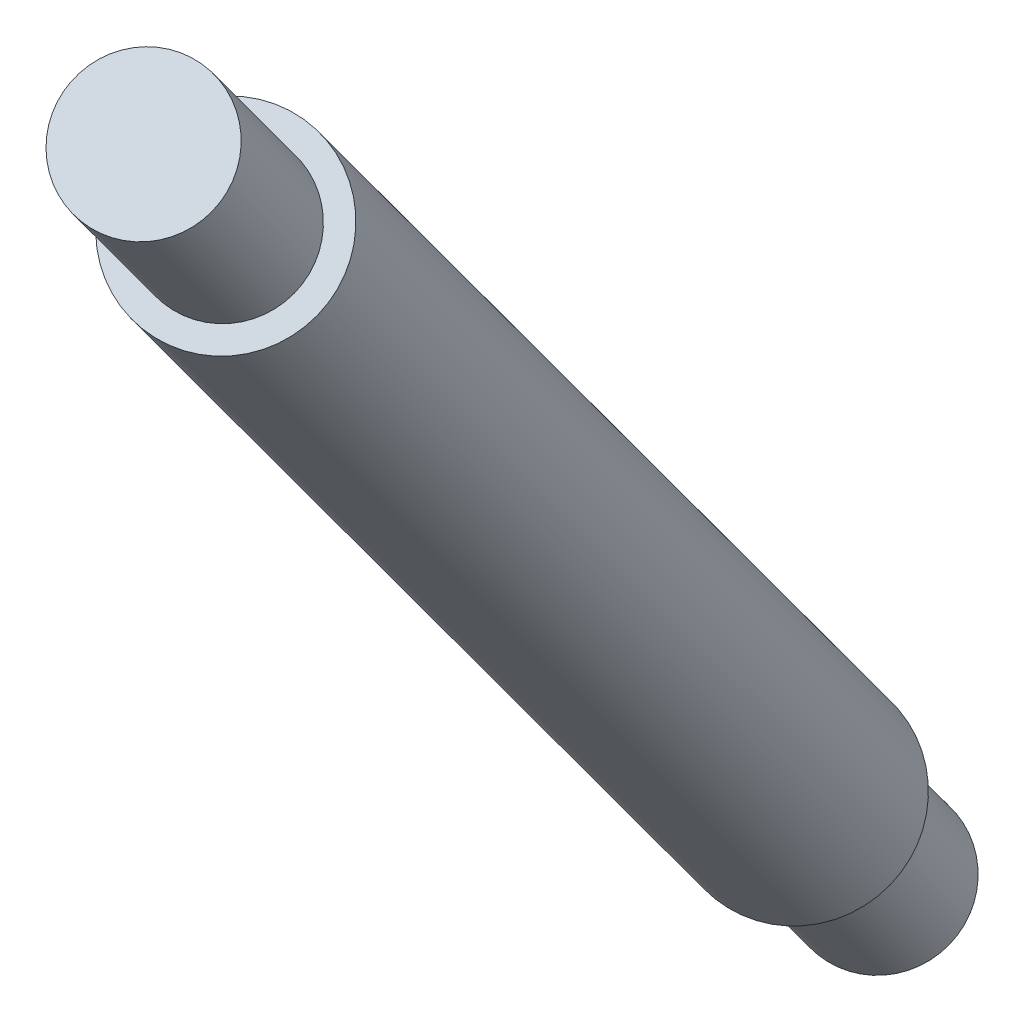
ISO-10303-21;
HEADER;
FILE_DESCRIPTION(('STEP AP214'),'2;1');
FILE_NAME('part.step','',(''),(''),'','','');
FILE_SCHEMA(('AUTOMOTIVE_DESIGN { 1 0 10303 214 1 1 1 1 }'));
ENDSEC;
DATA;
#1=APPLICATION_CONTEXT('core data for automotive mechanical design processes');
#2=APPLICATION_PROTOCOL_DEFINITION('international standard','automotive_design',2000,#1);
#3=PRODUCT_CONTEXT('',#1,'mechanical');
#4=PRODUCT('Part','Part','',(#3));
#5=PRODUCT_RELATED_PRODUCT_CATEGORY('part','',(#4));
#6=PRODUCT_DEFINITION_FORMATION('','',#4);
#7=PRODUCT_DEFINITION_CONTEXT('part definition',#1,'design');
#8=PRODUCT_DEFINITION('design','',#6,#7);
#9=PRODUCT_DEFINITION_SHAPE('','',#8);
#10=(LENGTH_UNIT() NAMED_UNIT(*) SI_UNIT(.MILLI.,.METRE.));
#11=(NAMED_UNIT(*) PLANE_ANGLE_UNIT() SI_UNIT($,.RADIAN.));
#12=(NAMED_UNIT(*) SI_UNIT($,.STERADIAN.) SOLID_ANGLE_UNIT());
#13=UNCERTAINTY_MEASURE_WITH_UNIT(LENGTH_MEASURE(1.E-05),#10,'distance_accuracy_value','');
#14=(GEOMETRIC_REPRESENTATION_CONTEXT(3) GLOBAL_UNCERTAINTY_ASSIGNED_CONTEXT((#13)) GLOBAL_UNIT_ASSIGNED_CONTEXT((#10,
#11,#12)) REPRESENTATION_CONTEXT('',''));
#15=CARTESIAN_POINT('',(0.,0.,0.));
#16=DIRECTION('',(0.,0.,1.));
#17=DIRECTION('',(1.,0.,0.));
#18=AXIS2_PLACEMENT_3D('',#15,#16,#17);
#19=CARTESIAN_POINT('',(-59.13249469121,-43.79049818765,8.643157456064));
#20=DIRECTION('',(0.352637034898918,0.707106781186952,0.612900580532543));
#21=DIRECTION('',(0.65489630431383,-0.654330019278361,0.378104557585951));
#22=AXIS2_PLACEMENT_3D('',#19,#20,#21);
#23=PLANE('',#22);
#24=CARTESIAN_POINT('',(-57.0389551413315,-44.3996323749582,8.14138494256849));
#25=DIRECTION('',(0.352637034898777,0.707106781187579,0.6129005805319));
#26=DIRECTION('',(0.,-0.654976126502471,0.75564957070842));
#27=AXIS2_PLACEMENT_3D('',#24,#25,#26);
#28=CIRCLE('',#27,1.50000000000611);
#29=CARTESIAN_POINT('',(-57.0389551413315,-45.3820965647159,9.27485929863574));
#30=VERTEX_POINT('',#29);
#31=EDGE_CURVE('E19',#30,#30,#28,.F.);
#32=ORIENTED_EDGE('',*,*,#31,.T.);
#33=EDGE_LOOP('',(#32));
#34=FACE_BOUND('',#33,.T.);
#35=ADVANCED_FACE('F15',(#34),#23,.F.);
#36=CARTESIAN_POINT('',(-57.0389551413315,-44.3996323749582,8.14138494256849));
#37=DIRECTION('',(0.352637034898777,0.707106781187579,0.6129005805319));
#38=DIRECTION('',(0.,-0.654976126502471,0.75564957070842));
#39=AXIS2_PLACEMENT_3D('',#36,#37,#38);
#40=CYLINDRICAL_SURFACE('',#39,1.50000000000611);
#41=CARTESIAN_POINT('',(-54.6586551557665,-39.6266616019456,12.2784638611557));
#42=DIRECTION('',(0.352637034898777,0.707106781187579,0.6129005805319));
#43=DIRECTION('',(0.,-0.654976126502471,0.75564957070842));
#44=AXIS2_PLACEMENT_3D('',#41,#42,#43);
#45=CIRCLE('',#44,1.50000000000611);
#46=CARTESIAN_POINT('',(-54.6586551557665,-40.6091257917033,13.411938217223));
#47=VERTEX_POINT('',#46);
#48=EDGE_CURVE('E35',#47,#47,#45,.F.);
#49=ORIENTED_EDGE('',*,*,#48,.T.);
#50=EDGE_LOOP('',(#49));
#51=FACE_BOUND('',#50,.T.);
#52=ORIENTED_EDGE('',*,*,#31,.F.);
#53=EDGE_LOOP('',(#52));
#54=FACE_BOUND('',#53,.T.);
#55=ADVANCED_FACE('F43',(#51,#54),#40,.T.);
#56=CARTESIAN_POINT('',(-57.41111052306,-38.82320468432,12.93515742184));
#57=DIRECTION('',(0.352637034898453,0.707106781187129,0.612900580532605));
#58=DIRECTION('',(0.654896304314089,-0.654330019278032,0.37810455758607));
#59=AXIS2_PLACEMENT_3D('',#56,#57,#58);
#60=PLANE('',#59);
#61=ORIENTED_EDGE('',*,*,#48,.F.);
#62=EDGE_LOOP('',(#61));
#63=FACE_BOUND('',#62,.T.);
#64=CARTESIAN_POINT('',(-54.6586551557654,-39.6266616019435,12.2784638611576));
#65=DIRECTION('',(0.352637034898778,0.70710678118758,0.612900580531898));
#66=DIRECTION('',(0.,-0.65497612650247,0.755649570708421));
#67=AXIS2_PLACEMENT_3D('',#64,#65,#66);
#68=CIRCLE('',#67,2.00000000002221);
#69=CARTESIAN_POINT('',(-54.6586551557654,-40.9366138549629,13.7897630025912));
#70=VERTEX_POINT('',#69);
#71=EDGE_CURVE('E33',#70,#70,#68,.F.);
#72=ORIENTED_EDGE('',*,*,#71,.T.);
#73=EDGE_LOOP('',(#72));
#74=FACE_BOUND('',#73,.T.);
#75=ADVANCED_FACE('F45',(#63,#74),#60,.F.);
#76=CARTESIAN_POINT('',(-54.6586551557654,-39.6266616019435,12.2784638611576));
#77=DIRECTION('',(0.352637034898778,0.70710678118758,0.612900580531898));
#78=DIRECTION('',(0.,-0.65497612650247,0.755649570708421));
#79=AXIS2_PLACEMENT_3D('',#76,#77,#78);
#80=CYLINDRICAL_SURFACE('',#79,2.00000000002221);
#81=CARTESIAN_POINT('',(-38.0847145155221,-6.3926428861257,41.0847911461581));
#82=DIRECTION('',(0.352637034898778,0.70710678118758,0.612900580531898));
#83=DIRECTION('',(0.,-0.65497612650247,0.755649570708421));
#84=AXIS2_PLACEMENT_3D('',#81,#82,#83);
#85=CIRCLE('',#84,2.00000000002221);
#86=CARTESIAN_POINT('',(-38.0847145155221,-7.70259513914519,42.5960902875917));
#87=VERTEX_POINT('',#86);
#88=EDGE_CURVE('E28',#87,#87,#85,.T.);
#89=ORIENTED_EDGE('',*,*,#88,.F.);
#90=EDGE_LOOP('',(#89));
#91=FACE_BOUND('',#90,.T.);
#92=ORIENTED_EDGE('',*,*,#71,.F.);
#93=EDGE_LOOP('',(#92));
#94=FACE_BOUND('',#93,.T.);
#95=ADVANCED_FACE('F52',(#91,#94),#80,.T.);
#96=CARTESIAN_POINT('',(-40.83716988284,-5.589185968545,41.7414847069));
#97=DIRECTION('',(0.352637034897914,0.70710678118629,0.612900580533884));
#98=DIRECTION('',(0.654896304312821,-0.654330019278925,0.378104557586722));
#99=AXIS2_PLACEMENT_3D('',#96,#97,#98);
#100=PLANE('',#99);
#101=CARTESIAN_POINT('',(-38.084714515521,-6.39264288612389,41.0847911461599));
#102=DIRECTION('',(0.352637034898776,0.707106781187582,0.612900580531898));
#103=DIRECTION('',(0.,-0.654976126502469,0.755649570708422));
#104=AXIS2_PLACEMENT_3D('',#101,#102,#103);
#105=CIRCLE('',#104,1.50000000004304);
#106=CARTESIAN_POINT('',(-38.084714515521,-7.37510707590578,42.218265502255));
#107=VERTEX_POINT('',#106);
#108=EDGE_CURVE('E23',#107,#107,#105,.F.);
#109=ORIENTED_EDGE('',*,*,#108,.T.);
#110=EDGE_LOOP('',(#109));
#111=FACE_BOUND('',#110,.T.);
#112=ORIENTED_EDGE('',*,*,#88,.T.);
#113=EDGE_LOOP('',(#112));
#114=FACE_BOUND('',#113,.T.);
#115=ADVANCED_FACE('F62',(#111,#114),#100,.T.);
#116=CARTESIAN_POINT('',(-38.084714515521,-6.39264288612389,41.0847911461599));
#117=DIRECTION('',(0.352637034898776,0.707106781187582,0.612900580531898));
#118=DIRECTION('',(0.,-0.654976126502469,0.755649570708422));
#119=AXIS2_PLACEMENT_3D('',#116,#117,#118);
#120=CYLINDRICAL_SURFACE('',#119,1.50000000004304);
#121=CARTESIAN_POINT('',(-35.7044145299545,-1.61967211310799,45.2218700647499));
#122=DIRECTION('',(0.352637034898776,0.707106781187582,0.612900580531898));
#123=DIRECTION('',(0.,-0.654976126502469,0.755649570708422));
#124=AXIS2_PLACEMENT_3D('',#121,#122,#123);
#125=CIRCLE('',#124,1.50000000004304);
#126=CARTESIAN_POINT('',(-35.7044145299545,-2.60213630288989,46.3553444208451));
#127=VERTEX_POINT('',#126);
#128=EDGE_CURVE('E10',#127,#127,#125,.T.);
#129=ORIENTED_EDGE('',*,*,#128,.F.);
#130=EDGE_LOOP('',(#129));
#131=FACE_BOUND('',#130,.T.);
#132=ORIENTED_EDGE('',*,*,#108,.F.);
#133=EDGE_LOOP('',(#132));
#134=FACE_BOUND('',#133,.T.);
#135=ADVANCED_FACE('F58',(#131,#134),#120,.T.);
#136=CARTESIAN_POINT('',(-37.79795407987,-1.010537925859,45.72364257833));
#137=DIRECTION('',(0.352637034898774,0.707106781186972,0.612900580532601));
#138=DIRECTION('',(0.654896304314469,-0.654330019278056,0.378104557585371));
#139=AXIS2_PLACEMENT_3D('',#136,#137,#138);
#140=PLANE('',#139);
#141=ORIENTED_EDGE('',*,*,#128,.T.);
#142=EDGE_LOOP('',(#141));
#143=FACE_BOUND('',#142,.T.);
#144=ADVANCED_FACE('F17',(#143),#140,.T.);
#145=CLOSED_SHELL('',(#35,#55,#75,#95,#115,#135,#144));
#146=MANIFOLD_SOLID_BREP('B1',#145);
#147=ADVANCED_BREP_SHAPE_REPRESENTATION('',(#18,#146),#14);
#148=SHAPE_DEFINITION_REPRESENTATION(#9,#147);
ENDSEC;
END-ISO-10303-21;
